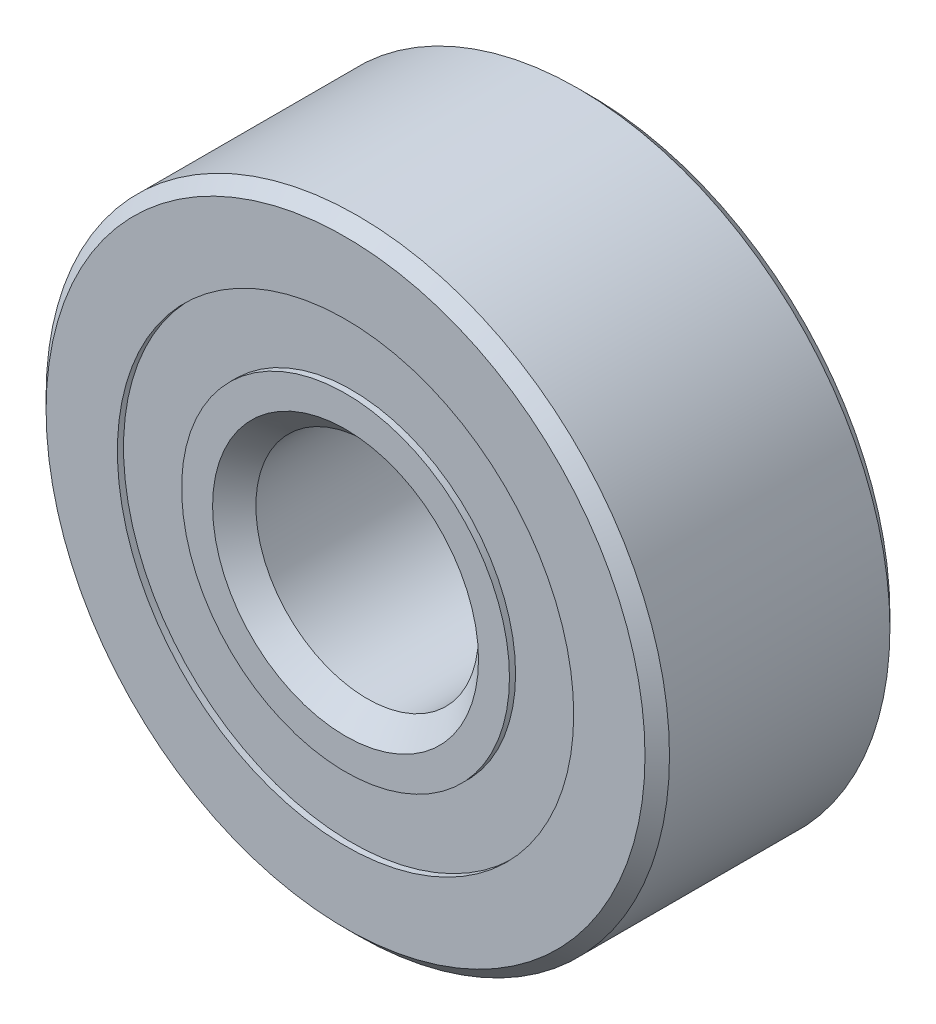
ISO-10303-21;
HEADER;
FILE_DESCRIPTION(('STEP AP214'),'2;1');
FILE_NAME('part.step','',(''),(''),'','','');
FILE_SCHEMA(('AUTOMOTIVE_DESIGN { 1 0 10303 214 1 1 1 1 }'));
ENDSEC;
DATA;
#1=APPLICATION_CONTEXT('core data for automotive mechanical design processes');
#2=APPLICATION_PROTOCOL_DEFINITION('international standard','automotive_design',2000,#1);
#3=PRODUCT_CONTEXT('',#1,'mechanical');
#4=PRODUCT('Part','Part','',(#3));
#5=PRODUCT_RELATED_PRODUCT_CATEGORY('part','',(#4));
#6=PRODUCT_DEFINITION_FORMATION('','',#4);
#7=PRODUCT_DEFINITION_CONTEXT('part definition',#1,'design');
#8=PRODUCT_DEFINITION('design','',#6,#7);
#9=PRODUCT_DEFINITION_SHAPE('','',#8);
#10=(LENGTH_UNIT() NAMED_UNIT(*) SI_UNIT(.MILLI.,.METRE.));
#11=(NAMED_UNIT(*) PLANE_ANGLE_UNIT() SI_UNIT($,.RADIAN.));
#12=(NAMED_UNIT(*) SI_UNIT($,.STERADIAN.) SOLID_ANGLE_UNIT());
#13=UNCERTAINTY_MEASURE_WITH_UNIT(LENGTH_MEASURE(1.E-05),#10,'distance_accuracy_value','');
#14=(GEOMETRIC_REPRESENTATION_CONTEXT(3) GLOBAL_UNCERTAINTY_ASSIGNED_CONTEXT((#13)) GLOBAL_UNIT_ASSIGNED_CONTEXT((#10,
#11,#12)) REPRESENTATION_CONTEXT('',''));
#15=CARTESIAN_POINT('',(0.,0.,0.));
#16=DIRECTION('',(0.,0.,1.));
#17=DIRECTION('',(1.,0.,0.));
#18=AXIS2_PLACEMENT_3D('',#15,#16,#17);
#19=CARTESIAN_POINT('',(0.,8.13375686813187,-4.14734375));
#20=DIRECTION('',(0.,0.,1.));
#21=DIRECTION('',(1.,0.,0.));
#22=AXIS2_PLACEMENT_3D('',#19,#20,#21);
#23=PLANE('',#22);
#24=CARTESIAN_POINT('',(0.,0.,-4.14734375));
#25=DIRECTION('',(0.,0.,1.));
#26=DIRECTION('',(1.,0.,0.));
#27=AXIS2_PLACEMENT_3D('',#24,#25,#26);
#28=CIRCLE('',#27,8.13375686813187);
#29=CARTESIAN_POINT('',(8.13375686813187,0.,-4.14734375));
#30=VERTEX_POINT('',#29);
#31=EDGE_CURVE('E66',#30,#30,#28,.T.);
#32=ORIENTED_EDGE('',*,*,#31,.F.);
#33=EDGE_LOOP('',(#32));
#34=FACE_BOUND('',#33,.T.);
#35=CARTESIAN_POINT('',(0.,0.,-4.14734375));
#36=DIRECTION('',(0.,0.,1.));
#37=DIRECTION('',(1.,0.,0.));
#38=AXIS2_PLACEMENT_3D('',#35,#36,#37);
#39=CIRCLE('',#38,5.84386235510606);
#40=CARTESIAN_POINT('',(5.84386235510606,0.,-4.14734375));
#41=VERTEX_POINT('',#40);
#42=EDGE_CURVE('E11',#41,#41,#39,.T.);
#43=ORIENTED_EDGE('',*,*,#42,.T.);
#44=EDGE_LOOP('',(#43));
#45=FACE_BOUND('',#44,.T.);
#46=ADVANCED_FACE('F52',(#34,#45),#23,.F.);
#47=CARTESIAN_POINT('',(0.,0.,4.365625));
#48=DIRECTION('',(0.,0.,1.));
#49=DIRECTION('',(1.,0.,0.));
#50=AXIS2_PLACEMENT_3D('',#47,#48,#49);
#51=CYLINDRICAL_SURFACE('',#50,5.84386235510606);
#52=ORIENTED_EDGE('',*,*,#42,.F.);
#53=EDGE_LOOP('',(#52));
#54=FACE_BOUND('',#53,.T.);
#55=CARTESIAN_POINT('',(0.,0.,-2.02891184331204));
#56=DIRECTION('',(0.,0.,1.));
#57=DIRECTION('',(1.,0.,0.));
#58=AXIS2_PLACEMENT_3D('',#55,#56,#57);
#59=CIRCLE('',#58,5.84386235510606);
#60=CARTESIAN_POINT('',(5.84386235510606,0.,-2.02891184331204));
#61=VERTEX_POINT('',#60);
#62=EDGE_CURVE('E58',#61,#61,#59,.T.);
#63=ORIENTED_EDGE('',*,*,#62,.T.);
#64=EDGE_LOOP('',(#63));
#65=FACE_BOUND('',#64,.T.);
#66=ADVANCED_FACE('F75',(#54,#65),#51,.F.);
#67=CARTESIAN_POINT('',(0.,8.13375686813187,-2.02891184331204));
#68=DIRECTION('',(0.,0.,-1.));
#69=DIRECTION('',(-1.,0.,0.));
#70=AXIS2_PLACEMENT_3D('',#67,#68,#69);
#71=PLANE('',#70);
#72=ORIENTED_EDGE('',*,*,#62,.F.);
#73=EDGE_LOOP('',(#72));
#74=FACE_BOUND('',#73,.T.);
#75=CARTESIAN_POINT('',(0.,0.,-2.02891184331204));
#76=DIRECTION('',(0.,0.,1.));
#77=DIRECTION('',(1.,0.,0.));
#78=AXIS2_PLACEMENT_3D('',#75,#76,#77);
#79=CIRCLE('',#78,8.13375686813187);
#80=CARTESIAN_POINT('',(8.13375686813187,0.,-2.02891184331204));
#81=VERTEX_POINT('',#80);
#82=EDGE_CURVE('E62',#81,#81,#79,.T.);
#83=ORIENTED_EDGE('',*,*,#82,.T.);
#84=EDGE_LOOP('',(#83));
#85=FACE_BOUND('',#84,.T.);
#86=ADVANCED_FACE('F79',(#74,#85),#71,.F.);
#87=CARTESIAN_POINT('',(0.,0.,4.365625));
#88=DIRECTION('',(0.,0.,1.));
#89=DIRECTION('',(1.,0.,0.));
#90=AXIS2_PLACEMENT_3D('',#87,#88,#89);
#91=CYLINDRICAL_SURFACE('',#90,8.13375686813187);
#92=ORIENTED_EDGE('',*,*,#82,.F.);
#93=EDGE_LOOP('',(#92));
#94=FACE_BOUND('',#93,.T.);
#95=ORIENTED_EDGE('',*,*,#31,.T.);
#96=EDGE_LOOP('',(#95));
#97=FACE_BOUND('',#96,.T.);
#98=ADVANCED_FACE('F72',(#94,#97),#91,.T.);
#99=CLOSED_SHELL('',(#46,#66,#86,#98));
#100=MANIFOLD_SOLID_BREP('B2',#99);
#101=CARTESIAN_POINT('',(0.,8.13375686813187,4.14734375));
#102=DIRECTION('',(0.,0.,-1.));
#103=DIRECTION('',(-1.,0.,0.));
#104=AXIS2_PLACEMENT_3D('',#101,#102,#103);
#105=PLANE('',#104);
#106=CARTESIAN_POINT('',(0.,0.,4.14734375));
#107=DIRECTION('',(0.,0.,1.));
#108=DIRECTION('',(1.,0.,0.));
#109=AXIS2_PLACEMENT_3D('',#106,#107,#108);
#110=CIRCLE('',#109,5.84386235510606);
#111=CARTESIAN_POINT('',(5.84386235510606,0.,4.14734375));
#112=VERTEX_POINT('',#111);
#113=EDGE_CURVE('E51',#112,#112,#110,.T.);
#114=ORIENTED_EDGE('',*,*,#113,.F.);
#115=EDGE_LOOP('',(#114));
#116=FACE_BOUND('',#115,.T.);
#117=CARTESIAN_POINT('',(0.,0.,4.14734375));
#118=DIRECTION('',(0.,0.,1.));
#119=DIRECTION('',(1.,0.,0.));
#120=AXIS2_PLACEMENT_3D('',#117,#118,#119);
#121=CIRCLE('',#120,8.13375686813187);
#122=CARTESIAN_POINT('',(8.13375686813187,0.,4.14734375));
#123=VERTEX_POINT('',#122);
#124=EDGE_CURVE('E126',#123,#123,#121,.T.);
#125=ORIENTED_EDGE('',*,*,#124,.T.);
#126=EDGE_LOOP('',(#125));
#127=FACE_BOUND('',#126,.T.);
#128=ADVANCED_FACE('F112',(#116,#127),#105,.F.);
#129=CARTESIAN_POINT('',(0.,0.,4.365625));
#130=DIRECTION('',(0.,0.,1.));
#131=DIRECTION('',(1.,0.,0.));
#132=AXIS2_PLACEMENT_3D('',#129,#130,#131);
#133=CYLINDRICAL_SURFACE('',#132,5.84386235510606);
#134=CARTESIAN_POINT('',(0.,0.,2.02891184331204));
#135=DIRECTION('',(0.,0.,1.));
#136=DIRECTION('',(1.,0.,0.));
#137=AXIS2_PLACEMENT_3D('',#134,#135,#136);
#138=CIRCLE('',#137,5.84386235510606);
#139=CARTESIAN_POINT('',(5.84386235510606,0.,2.02891184331204));
#140=VERTEX_POINT('',#139);
#141=EDGE_CURVE('E118',#140,#140,#138,.T.);
#142=ORIENTED_EDGE('',*,*,#141,.F.);
#143=EDGE_LOOP('',(#142));
#144=FACE_BOUND('',#143,.T.);
#145=ORIENTED_EDGE('',*,*,#113,.T.);
#146=EDGE_LOOP('',(#145));
#147=FACE_BOUND('',#146,.T.);
#148=ADVANCED_FACE('F141',(#144,#147),#133,.F.);
#149=CARTESIAN_POINT('',(0.,8.13375686813187,2.02891184331204));
#150=DIRECTION('',(0.,0.,1.));
#151=DIRECTION('',(1.,0.,0.));
#152=AXIS2_PLACEMENT_3D('',#149,#150,#151);
#153=PLANE('',#152);
#154=CARTESIAN_POINT('',(0.,0.,2.02891184331204));
#155=DIRECTION('',(0.,0.,1.));
#156=DIRECTION('',(1.,0.,0.));
#157=AXIS2_PLACEMENT_3D('',#154,#155,#156);
#158=CIRCLE('',#157,8.13375686813187);
#159=CARTESIAN_POINT('',(8.13375686813187,0.,2.02891184331204));
#160=VERTEX_POINT('',#159);
#161=EDGE_CURVE('E122',#160,#160,#158,.T.);
#162=ORIENTED_EDGE('',*,*,#161,.F.);
#163=EDGE_LOOP('',(#162));
#164=FACE_BOUND('',#163,.T.);
#165=ORIENTED_EDGE('',*,*,#141,.T.);
#166=EDGE_LOOP('',(#165));
#167=FACE_BOUND('',#166,.T.);
#168=ADVANCED_FACE('F136',(#164,#167),#153,.F.);
#169=CARTESIAN_POINT('',(0.,0.,4.365625));
#170=DIRECTION('',(0.,0.,1.));
#171=DIRECTION('',(1.,0.,0.));
#172=AXIS2_PLACEMENT_3D('',#169,#170,#171);
#173=CYLINDRICAL_SURFACE('',#172,8.13375686813187);
#174=ORIENTED_EDGE('',*,*,#124,.F.);
#175=EDGE_LOOP('',(#174));
#176=FACE_BOUND('',#175,.T.);
#177=ORIENTED_EDGE('',*,*,#161,.T.);
#178=EDGE_LOOP('',(#177));
#179=FACE_BOUND('',#178,.T.);
#180=ADVANCED_FACE('F133',(#176,#179),#173,.T.);
#181=CLOSED_SHELL('',(#128,#148,#168,#180));
#182=MANIFOLD_SOLID_BREP('B6',#181);
#183=CARTESIAN_POINT('',(-5.33202707188474,5.33202707188487,0.));
#184=DIRECTION('',(0.,0.,1.));
#185=DIRECTION('',(-0.707106781186539,0.707106781186556,0.));
#186=AXIS2_PLACEMENT_3D('',#183,#184,#185);
#187=SPHERICAL_SURFACE('',#186,2.02891184331204);
#188=CARTESIAN_POINT('',(-5.33202707188474,5.33202707188487,2.02891184331204));
#189=VERTEX_POINT('',#188);
#190=VERTEX_LOOP('',#189);
#191=FACE_BOUND('',#190,.T.);
#192=ADVANCED_FACE('F196',(#191),#187,.T.);
#193=CLOSED_SHELL('',(#192));
#194=MANIFOLD_SOLID_BREP('B46',#193);
#195=CARTESIAN_POINT('',(-7.540625,0.,0.));
#196=DIRECTION('',(0.,0.,1.));
#197=DIRECTION('',(-1.,0.,0.));
#198=AXIS2_PLACEMENT_3D('',#195,#196,#197);
#199=SPHERICAL_SURFACE('',#198,2.02891184331204);
#200=CARTESIAN_POINT('',(-7.540625,0.,2.02891184331204));
#201=VERTEX_POINT('',#200);
#202=VERTEX_LOOP('',#201);
#203=FACE_BOUND('',#202,.T.);
#204=ADVANCED_FACE('F233',(#203),#199,.T.);
#205=CLOSED_SHELL('',(#204));
#206=MANIFOLD_SOLID_BREP('B108',#205);
#207=CARTESIAN_POINT('',(-5.33202707188486,-5.33202707188476,0.));
#208=DIRECTION('',(0.,0.,1.));
#209=DIRECTION('',(-0.707106781186554,-0.707106781186541,0.));
#210=AXIS2_PLACEMENT_3D('',#207,#208,#209);
#211=SPHERICAL_SURFACE('',#210,2.02891184331204);
#212=CARTESIAN_POINT('',(-5.33202707188486,-5.33202707188476,2.02891184331204));
#213=VERTEX_POINT('',#212);
#214=VERTEX_LOOP('',#213);
#215=FACE_BOUND('',#214,.T.);
#216=ADVANCED_FACE('F268',(#215),#211,.T.);
#217=CLOSED_SHELL('',(#216));
#218=MANIFOLD_SOLID_BREP('B192',#217);
#219=CARTESIAN_POINT('',(0.,-7.540625,0.));
#220=DIRECTION('',(0.,0.,1.));
#221=DIRECTION('',(0.,-1.,0.));
#222=AXIS2_PLACEMENT_3D('',#219,#220,#221);
#223=SPHERICAL_SURFACE('',#222,2.02891184331204);
#224=CARTESIAN_POINT('',(0.,-7.540625,2.02891184331204));
#225=VERTEX_POINT('',#224);
#226=VERTEX_LOOP('',#225);
#227=FACE_BOUND('',#226,.T.);
#228=ADVANCED_FACE('F305',(#227),#223,.T.);
#229=CLOSED_SHELL('',(#228));
#230=MANIFOLD_SOLID_BREP('B229',#229);
#231=CARTESIAN_POINT('',(5.33202707188478,-5.33202707188484,0.));
#232=DIRECTION('',(0.,0.,1.));
#233=DIRECTION('',(0.707106781186544,-0.707106781186551,0.));
#234=AXIS2_PLACEMENT_3D('',#231,#232,#233);
#235=SPHERICAL_SURFACE('',#234,2.02891184331204);
#236=CARTESIAN_POINT('',(5.33202707188478,-5.33202707188484,2.02891184331204));
#237=VERTEX_POINT('',#236);
#238=VERTEX_LOOP('',#237);
#239=FACE_BOUND('',#238,.T.);
#240=ADVANCED_FACE('F342',(#239),#235,.T.);
#241=CLOSED_SHELL('',(#240));
#242=MANIFOLD_SOLID_BREP('B264',#241);
#243=CARTESIAN_POINT('',(7.540625,0.,0.));
#244=DIRECTION('',(0.,0.,1.));
#245=DIRECTION('',(1.,0.,0.));
#246=AXIS2_PLACEMENT_3D('',#243,#244,#245);
#247=SPHERICAL_SURFACE('',#246,2.02891184331204);
#248=CARTESIAN_POINT('',(7.540625,0.,2.02891184331204));
#249=VERTEX_POINT('',#248);
#250=VERTEX_LOOP('',#249);
#251=FACE_BOUND('',#250,.T.);
#252=ADVANCED_FACE('F377',(#251),#247,.T.);
#253=CLOSED_SHELL('',(#252));
#254=MANIFOLD_SOLID_BREP('B301',#253);
#255=CARTESIAN_POINT('',(5.33202707188482,5.3320270718848,0.));
#256=DIRECTION('',(0.,0.,1.));
#257=DIRECTION('',(0.707106781186549,0.707106781186546,0.));
#258=AXIS2_PLACEMENT_3D('',#255,#256,#257);
#259=SPHERICAL_SURFACE('',#258,2.02891184331204);
#260=CARTESIAN_POINT('',(5.33202707188482,5.3320270718848,2.02891184331204));
#261=VERTEX_POINT('',#260);
#262=VERTEX_LOOP('',#261);
#263=FACE_BOUND('',#262,.T.);
#264=ADVANCED_FACE('F412',(#263),#259,.T.);
#265=CLOSED_SHELL('',(#264));
#266=MANIFOLD_SOLID_BREP('B338',#265);
#267=CARTESIAN_POINT('',(0.,7.540625,0.));
#268=DIRECTION('',(0.,0.,1.));
#269=DIRECTION('',(0.,1.,0.));
#270=AXIS2_PLACEMENT_3D('',#267,#268,#269);
#271=SPHERICAL_SURFACE('',#270,2.02891184331204);
#272=CARTESIAN_POINT('',(0.,7.540625,2.02891184331204));
#273=VERTEX_POINT('',#272);
#274=VERTEX_LOOP('',#273);
#275=FACE_BOUND('',#274,.T.);
#276=ADVANCED_FACE('F451',(#275),#271,.T.);
#277=CLOSED_SHELL('',(#276));
#278=MANIFOLD_SOLID_BREP('B373',#277);
#279=CARTESIAN_POINT('',(0.,0.,4.365625));
#280=DIRECTION('',(0.,0.,1.));
#281=DIRECTION('',(1.,0.,0.));
#282=AXIS2_PLACEMENT_3D('',#279,#280,#281);
#283=CYLINDRICAL_SURFACE('',#282,5.84386235510606);
#284=CARTESIAN_POINT('',(0.,0.,4.365625));
#285=DIRECTION('',(0.,0.,1.));
#286=DIRECTION('',(1.,0.,0.));
#287=AXIS2_PLACEMENT_3D('',#284,#285,#286);
#288=CIRCLE('',#287,5.84386235510606);
#289=CARTESIAN_POINT('',(5.84386235510606,0.,4.365625));
#290=VERTEX_POINT('',#289);
#291=EDGE_CURVE('E509',#290,#290,#288,.T.);
#292=ORIENTED_EDGE('',*,*,#291,.F.);
#293=EDGE_LOOP('',(#292));
#294=FACE_BOUND('',#293,.T.);
#295=CARTESIAN_POINT('',(0.,0.,4.14734375));
#296=DIRECTION('',(0.,0.,1.));
#297=DIRECTION('',(1.,0.,0.));
#298=AXIS2_PLACEMENT_3D('',#295,#296,#297);
#299=CIRCLE('',#298,5.84386235510606);
#300=CARTESIAN_POINT('',(5.84386235510606,0.,4.14734375));
#301=VERTEX_POINT('',#300);
#302=EDGE_CURVE('E450',#301,#301,#299,.T.);
#303=ORIENTED_EDGE('',*,*,#302,.T.);
#304=EDGE_LOOP('',(#303));
#305=FACE_BOUND('',#304,.T.);
#306=ADVANCED_FACE('F469',(#294,#305),#283,.T.);
#307=CARTESIAN_POINT('',(0.,5.84386235510606,4.14734375));
#308=DIRECTION('',(0.,0.,1.));
#309=DIRECTION('',(1.,0.,0.));
#310=AXIS2_PLACEMENT_3D('',#307,#308,#309);
#311=PLANE('',#310);
#312=ORIENTED_EDGE('',*,*,#302,.F.);
#313=EDGE_LOOP('',(#312));
#314=FACE_BOUND('',#313,.T.);
#315=CARTESIAN_POINT('',(0.,0.,4.14734375));
#316=DIRECTION('',(0.,0.,1.));
#317=DIRECTION('',(1.,0.,0.));
#318=AXIS2_PLACEMENT_3D('',#315,#316,#317);
#319=CIRCLE('',#318,5.62558110510605);
#320=CARTESIAN_POINT('',(5.62558110510605,0.,4.14734375));
#321=VERTEX_POINT('',#320);
#322=EDGE_CURVE('E475',#321,#321,#319,.T.);
#323=ORIENTED_EDGE('',*,*,#322,.T.);
#324=EDGE_LOOP('',(#323));
#325=FACE_BOUND('',#324,.T.);
#326=ADVANCED_FACE('F516',(#314,#325),#311,.F.);
#327=CARTESIAN_POINT('',(0.,0.,3.26199422323793));
#328=DIRECTION('',(0.,0.,1.));
#329=DIRECTION('',(1.,0.,0.));
#330=AXIS2_PLACEMENT_3D('',#327,#328,#329);
#331=CONICAL_SURFACE('',#330,4.74023157834398,0.78539816339745);
#332=ORIENTED_EDGE('',*,*,#322,.F.);
#333=EDGE_LOOP('',(#332));
#334=FACE_BOUND('',#333,.T.);
#335=CARTESIAN_POINT('',(0.,0.,3.26199422323793));
#336=DIRECTION('',(0.,0.,1.));
#337=DIRECTION('',(1.,0.,0.));
#338=AXIS2_PLACEMENT_3D('',#335,#336,#337);
#339=CIRCLE('',#338,4.74023157834398);
#340=CARTESIAN_POINT('',(4.74023157834398,0.,3.26199422323793));
#341=VERTEX_POINT('',#340);
#342=EDGE_CURVE('E479',#341,#341,#339,.T.);
#343=ORIENTED_EDGE('',*,*,#342,.T.);
#344=EDGE_LOOP('',(#343));
#345=FACE_BOUND('',#344,.T.);
#346=ADVANCED_FACE('F520',(#334,#345),#331,.T.);
#347=CARTESIAN_POINT('',(0.,0.,4.365625));
#348=DIRECTION('',(0.,0.,1.));
#349=DIRECTION('',(1.,0.,0.));
#350=AXIS2_PLACEMENT_3D('',#347,#348,#349);
#351=CYLINDRICAL_SURFACE('',#350,4.74023157834398);
#352=ORIENTED_EDGE('',*,*,#342,.F.);
#353=EDGE_LOOP('',(#352));
#354=FACE_BOUND('',#353,.T.);
#355=CARTESIAN_POINT('',(0.,0.,0.));
#356=DIRECTION('',(0.,0.,1.));
#357=DIRECTION('',(1.,0.,0.));
#358=AXIS2_PLACEMENT_3D('',#355,#356,#357);
#359=CIRCLE('',#358,4.74023157834398);
#360=CARTESIAN_POINT('',(4.74023157834398,0.,0.));
#361=VERTEX_POINT('',#360);
#362=EDGE_CURVE('E483',#361,#361,#359,.T.);
#363=ORIENTED_EDGE('',*,*,#362,.T.);
#364=EDGE_LOOP('',(#363));
#365=FACE_BOUND('',#364,.T.);
#366=ADVANCED_FACE('F525',(#354,#365),#351,.T.);
#367=CARTESIAN_POINT('',(0.,4.74023157834398,0.));
#368=DIRECTION('',(0.,0.,-1.));
#369=DIRECTION('',(-1.,0.,0.));
#370=AXIS2_PLACEMENT_3D('',#367,#368,#369);
#371=PLANE('',#370);
#372=ORIENTED_EDGE('',*,*,#362,.F.);
#373=EDGE_LOOP('',(#372));
#374=FACE_BOUND('',#373,.T.);
#375=CARTESIAN_POINT('',(0.,0.,0.));
#376=DIRECTION('',(0.,0.,1.));
#377=DIRECTION('',(1.,0.,0.));
#378=AXIS2_PLACEMENT_3D('',#375,#376,#377);
#379=CIRCLE('',#378,5.51171315668796);
#380=CARTESIAN_POINT('',(5.51171315668796,0.,0.));
#381=VERTEX_POINT('',#380);
#382=EDGE_CURVE('E488',#381,#381,#379,.T.);
#383=ORIENTED_EDGE('',*,*,#382,.T.);
#384=EDGE_LOOP('',(#383));
#385=FACE_BOUND('',#384,.T.);
#386=ADVANCED_FACE('F531',(#374,#385),#371,.F.);
#387=CARTESIAN_POINT('',(0.,0.,0.));
#388=DIRECTION('',(0.,0.,1.));
#389=DIRECTION('',(1.,0.,0.));
#390=AXIS2_PLACEMENT_3D('',#387,#388,#389);
#391=TOROIDAL_SURFACE('',#390,7.540625,2.02891184331204);
#392=ORIENTED_EDGE('',*,*,#382,.F.);
#393=EDGE_LOOP('',(#392));
#394=FACE_BOUND('',#393,.T.);
#395=CARTESIAN_POINT('',(0.,0.,-1.94027777777778));
#396=DIRECTION('',(0.,0.,1.));
#397=DIRECTION('',(1.,0.,0.));
#398=AXIS2_PLACEMENT_3D('',#395,#396,#397);
#399=CIRCLE('',#398,6.94749313186813);
#400=CARTESIAN_POINT('',(6.94749313186813,0.,-1.94027777777778));
#401=VERTEX_POINT('',#400);
#402=EDGE_CURVE('E491',#401,#401,#399,.T.);
#403=ORIENTED_EDGE('',*,*,#402,.T.);
#404=EDGE_LOOP('',(#403));
#405=FACE_BOUND('',#404,.T.);
#406=ADVANCED_FACE('F535',(#394,#405),#391,.F.);
#407=CARTESIAN_POINT('',(0.,0.,4.365625));
#408=DIRECTION('',(0.,0.,1.));
#409=DIRECTION('',(1.,0.,0.));
#410=AXIS2_PLACEMENT_3D('',#407,#408,#409);
#411=CYLINDRICAL_SURFACE('',#410,6.94749313186813);
#412=ORIENTED_EDGE('',*,*,#402,.F.);
#413=EDGE_LOOP('',(#412));
#414=FACE_BOUND('',#413,.T.);
#415=CARTESIAN_POINT('',(0.,0.,-4.365625));
#416=DIRECTION('',(0.,0.,1.));
#417=DIRECTION('',(1.,0.,0.));
#418=AXIS2_PLACEMENT_3D('',#415,#416,#417);
#419=CIRCLE('',#418,6.94749313186813);
#420=CARTESIAN_POINT('',(6.94749313186813,0.,-4.365625));
#421=VERTEX_POINT('',#420);
#422=EDGE_CURVE('E494',#421,#421,#419,.T.);
#423=ORIENTED_EDGE('',*,*,#422,.T.);
#424=EDGE_LOOP('',(#423));
#425=FACE_BOUND('',#424,.T.);
#426=ADVANCED_FACE('F539',(#414,#425),#411,.T.);
#427=CARTESIAN_POINT('',(0.,4.4053125,-4.365625));
#428=DIRECTION('',(0.,0.,1.));
#429=DIRECTION('',(1.,0.,0.));
#430=AXIS2_PLACEMENT_3D('',#427,#428,#429);
#431=PLANE('',#430);
#432=ORIENTED_EDGE('',*,*,#422,.F.);
#433=EDGE_LOOP('',(#432));
#434=FACE_BOUND('',#433,.T.);
#435=CARTESIAN_POINT('',(0.,0.,-4.365625));
#436=DIRECTION('',(0.,0.,1.));
#437=DIRECTION('',(1.,0.,0.));
#438=AXIS2_PLACEMENT_3D('',#435,#436,#437);
#439=CIRCLE('',#438,4.4053125);
#440=CARTESIAN_POINT('',(4.4053125,0.,-4.365625));
#441=VERTEX_POINT('',#440);
#442=EDGE_CURVE('E497',#441,#441,#439,.T.);
#443=ORIENTED_EDGE('',*,*,#442,.T.);
#444=EDGE_LOOP('',(#443));
#445=FACE_BOUND('',#444,.T.);
#446=ADVANCED_FACE('F543',(#434,#445),#431,.F.);
#447=CARTESIAN_POINT('',(0.,0.,-3.9290625));
#448=DIRECTION('',(0.,0.,-1.));
#449=DIRECTION('',(-1.,0.,0.));
#450=AXIS2_PLACEMENT_3D('',#447,#448,#449);
#451=CONICAL_SURFACE('',#450,3.96875,0.785398163397447);
#452=ORIENTED_EDGE('',*,*,#442,.F.);
#453=EDGE_LOOP('',(#452));
#454=FACE_BOUND('',#453,.T.);
#455=CARTESIAN_POINT('',(0.,0.,-3.9290625));
#456=DIRECTION('',(0.,0.,1.));
#457=DIRECTION('',(1.,0.,0.));
#458=AXIS2_PLACEMENT_3D('',#455,#456,#457);
#459=CIRCLE('',#458,3.96875);
#460=CARTESIAN_POINT('',(3.96875,0.,-3.9290625));
#461=VERTEX_POINT('',#460);
#462=EDGE_CURVE('E500',#461,#461,#459,.T.);
#463=ORIENTED_EDGE('',*,*,#462,.T.);
#464=EDGE_LOOP('',(#463));
#465=FACE_BOUND('',#464,.T.);
#466=ADVANCED_FACE('F547',(#454,#465),#451,.F.);
#467=CARTESIAN_POINT('',(0.,0.,4.365625));
#468=DIRECTION('',(0.,0.,1.));
#469=DIRECTION('',(1.,0.,0.));
#470=AXIS2_PLACEMENT_3D('',#467,#468,#469);
#471=CYLINDRICAL_SURFACE('',#470,3.96875);
#472=ORIENTED_EDGE('',*,*,#462,.F.);
#473=EDGE_LOOP('',(#472));
#474=FACE_BOUND('',#473,.T.);
#475=CARTESIAN_POINT('',(0.,0.,3.59414342165603));
#476=DIRECTION('',(0.,0.,1.));
#477=DIRECTION('',(1.,0.,0.));
#478=AXIS2_PLACEMENT_3D('',#475,#476,#477);
#479=CIRCLE('',#478,3.96875);
#480=CARTESIAN_POINT('',(3.96875,0.,3.59414342165603));
#481=VERTEX_POINT('',#480);
#482=EDGE_CURVE('E503',#481,#481,#479,.T.);
#483=ORIENTED_EDGE('',*,*,#482,.T.);
#484=EDGE_LOOP('',(#483));
#485=FACE_BOUND('',#484,.T.);
#486=ADVANCED_FACE('F551',(#474,#485),#471,.F.);
#487=CARTESIAN_POINT('',(0.,0.,4.365625));
#488=DIRECTION('',(0.,0.,1.));
#489=DIRECTION('',(1.,0.,0.));
#490=AXIS2_PLACEMENT_3D('',#487,#488,#489);
#491=CONICAL_SURFACE('',#490,4.74023157834398,0.78539816339745);
#492=ORIENTED_EDGE('',*,*,#482,.F.);
#493=EDGE_LOOP('',(#492));
#494=FACE_BOUND('',#493,.T.);
#495=CARTESIAN_POINT('',(0.,0.,4.365625));
#496=DIRECTION('',(0.,0.,1.));
#497=DIRECTION('',(1.,0.,0.));
#498=AXIS2_PLACEMENT_3D('',#495,#496,#497);
#499=CIRCLE('',#498,4.74023157834398);
#500=CARTESIAN_POINT('',(4.74023157834398,0.,4.365625));
#501=VERTEX_POINT('',#500);
#502=EDGE_CURVE('E506',#501,#501,#499,.T.);
#503=ORIENTED_EDGE('',*,*,#502,.T.);
#504=EDGE_LOOP('',(#503));
#505=FACE_BOUND('',#504,.T.);
#506=ADVANCED_FACE('F555',(#494,#505),#491,.F.);
#507=CARTESIAN_POINT('',(0.,5.84386235510606,4.365625));
#508=DIRECTION('',(0.,0.,-1.));
#509=DIRECTION('',(-1.,0.,0.));
#510=AXIS2_PLACEMENT_3D('',#507,#508,#509);
#511=PLANE('',#510);
#512=ORIENTED_EDGE('',*,*,#502,.F.);
#513=EDGE_LOOP('',(#512));
#514=FACE_BOUND('',#513,.T.);
#515=ORIENTED_EDGE('',*,*,#291,.T.);
#516=EDGE_LOOP('',(#515));
#517=FACE_BOUND('',#516,.T.);
#518=ADVANCED_FACE('F513',(#514,#517),#511,.F.);
#519=CLOSED_SHELL('',(#306,#326,#346,#366,#386,#406,#426,#446,#466,#486,#506,#518));
#520=MANIFOLD_SOLID_BREP('B408',#519);
#521=CARTESIAN_POINT('',(0.,0.,3.9290625));
#522=DIRECTION('',(0.,0.,-1.));
#523=DIRECTION('',(-1.,0.,0.));
#524=AXIS2_PLACEMENT_3D('',#521,#522,#523);
#525=CONICAL_SURFACE('',#524,11.1125,0.785398163397447);
#526=CARTESIAN_POINT('',(0.,0.,4.365625));
#527=DIRECTION('',(0.,0.,1.));
#528=DIRECTION('',(1.,0.,0.));
#529=AXIS2_PLACEMENT_3D('',#526,#527,#528);
#530=CIRCLE('',#529,10.6759375);
#531=CARTESIAN_POINT('',(10.6759375,0.,4.365625));
#532=VERTEX_POINT('',#531);
#533=EDGE_CURVE('E655',#532,#532,#530,.T.);
#534=ORIENTED_EDGE('',*,*,#533,.F.);
#535=EDGE_LOOP('',(#534));
#536=FACE_BOUND('',#535,.T.);
#537=CARTESIAN_POINT('',(0.,0.,3.9290625));
#538=DIRECTION('',(0.,0.,1.));
#539=DIRECTION('',(1.,0.,0.));
#540=AXIS2_PLACEMENT_3D('',#537,#538,#539);
#541=CIRCLE('',#540,11.1125);
#542=CARTESIAN_POINT('',(11.1125,0.,3.9290625));
#543=VERTEX_POINT('',#542);
#544=EDGE_CURVE('E468',#543,#543,#541,.T.);
#545=ORIENTED_EDGE('',*,*,#544,.T.);
#546=EDGE_LOOP('',(#545));
#547=FACE_BOUND('',#546,.T.);
#548=ADVANCED_FACE('F627',(#536,#547),#525,.T.);
#549=CARTESIAN_POINT('',(0.,0.,4.365625));
#550=DIRECTION('',(0.,0.,1.));
#551=DIRECTION('',(1.,0.,0.));
#552=AXIS2_PLACEMENT_3D('',#549,#550,#551);
#553=CYLINDRICAL_SURFACE('',#552,11.1125);
#554=ORIENTED_EDGE('',*,*,#544,.F.);
#555=EDGE_LOOP('',(#554));
#556=FACE_BOUND('',#555,.T.);
#557=CARTESIAN_POINT('',(0.,0.,-3.9290625));
#558=DIRECTION('',(0.,0.,1.));
#559=DIRECTION('',(1.,0.,0.));
#560=AXIS2_PLACEMENT_3D('',#557,#558,#559);
#561=CIRCLE('',#560,11.1125);
#562=CARTESIAN_POINT('',(11.1125,0.,-3.9290625));
#563=VERTEX_POINT('',#562);
#564=EDGE_CURVE('E633',#563,#563,#561,.T.);
#565=ORIENTED_EDGE('',*,*,#564,.T.);
#566=EDGE_LOOP('',(#565));
#567=FACE_BOUND('',#566,.T.);
#568=ADVANCED_FACE('F662',(#556,#567),#553,.T.);
#569=CARTESIAN_POINT('',(0.,0.,-4.365625));
#570=DIRECTION('',(0.,0.,1.));
#571=DIRECTION('',(1.,0.,0.));
#572=AXIS2_PLACEMENT_3D('',#569,#570,#571);
#573=CONICAL_SURFACE('',#572,10.6759375,0.785398163397446);
#574=ORIENTED_EDGE('',*,*,#564,.F.);
#575=EDGE_LOOP('',(#574));
#576=FACE_BOUND('',#575,.T.);
#577=CARTESIAN_POINT('',(0.,0.,-4.365625));
#578=DIRECTION('',(0.,0.,1.));
#579=DIRECTION('',(1.,0.,0.));
#580=AXIS2_PLACEMENT_3D('',#577,#578,#579);
#581=CIRCLE('',#580,10.6759375);
#582=CARTESIAN_POINT('',(10.6759375,0.,-4.365625));
#583=VERTEX_POINT('',#582);
#584=EDGE_CURVE('E637',#583,#583,#581,.T.);
#585=ORIENTED_EDGE('',*,*,#584,.T.);
#586=EDGE_LOOP('',(#585));
#587=FACE_BOUND('',#586,.T.);
#588=ADVANCED_FACE('F666',(#576,#587),#573,.T.);
#589=CARTESIAN_POINT('',(0.,10.6759375,-4.365625));
#590=DIRECTION('',(0.,0.,1.));
#591=DIRECTION('',(1.,0.,0.));
#592=AXIS2_PLACEMENT_3D('',#589,#590,#591);
#593=PLANE('',#592);
#594=ORIENTED_EDGE('',*,*,#584,.F.);
#595=EDGE_LOOP('',(#594));
#596=FACE_BOUND('',#595,.T.);
#597=CARTESIAN_POINT('',(0.,0.,-4.365625));
#598=DIRECTION('',(0.,0.,1.));
#599=DIRECTION('',(1.,0.,0.));
#600=AXIS2_PLACEMENT_3D('',#597,#598,#599);
#601=CIRCLE('',#600,8.13375686813187);
#602=CARTESIAN_POINT('',(8.13375686813187,0.,-4.365625));
#603=VERTEX_POINT('',#602);
#604=EDGE_CURVE('E641',#603,#603,#601,.T.);
#605=ORIENTED_EDGE('',*,*,#604,.T.);
#606=EDGE_LOOP('',(#605));
#607=FACE_BOUND('',#606,.T.);
#608=ADVANCED_FACE('F671',(#596,#607),#593,.F.);
#609=CARTESIAN_POINT('',(0.,0.,4.365625));
#610=DIRECTION('',(0.,0.,1.));
#611=DIRECTION('',(1.,0.,0.));
#612=AXIS2_PLACEMENT_3D('',#609,#610,#611);
#613=CYLINDRICAL_SURFACE('',#612,8.13375686813187);
#614=ORIENTED_EDGE('',*,*,#604,.F.);
#615=EDGE_LOOP('',(#614));
#616=FACE_BOUND('',#615,.T.);
#617=CARTESIAN_POINT('',(0.,0.,-1.94027777777778));
#618=DIRECTION('',(0.,0.,1.));
#619=DIRECTION('',(1.,0.,0.));
#620=AXIS2_PLACEMENT_3D('',#617,#618,#619);
#621=CIRCLE('',#620,8.13375686813187);
#622=CARTESIAN_POINT('',(8.13375686813187,0.,-1.94027777777778));
#623=VERTEX_POINT('',#622);
#624=EDGE_CURVE('E646',#623,#623,#621,.T.);
#625=ORIENTED_EDGE('',*,*,#624,.T.);
#626=EDGE_LOOP('',(#625));
#627=FACE_BOUND('',#626,.T.);
#628=ADVANCED_FACE('F677',(#616,#627),#613,.F.);
#629=CARTESIAN_POINT('',(0.,0.,0.));
#630=DIRECTION('',(0.,0.,1.));
#631=DIRECTION('',(1.,0.,0.));
#632=AXIS2_PLACEMENT_3D('',#629,#630,#631);
#633=TOROIDAL_SURFACE('',#632,7.540625,2.02891184331204);
#634=ORIENTED_EDGE('',*,*,#624,.F.);
#635=EDGE_LOOP('',(#634));
#636=FACE_BOUND('',#635,.T.);
#637=CARTESIAN_POINT('',(0.,0.,1.94027777777778));
#638=DIRECTION('',(0.,0.,1.));
#639=DIRECTION('',(1.,0.,0.));
#640=AXIS2_PLACEMENT_3D('',#637,#638,#639);
#641=CIRCLE('',#640,8.13375686813187);
#642=CARTESIAN_POINT('',(8.13375686813187,0.,1.94027777777778));
#643=VERTEX_POINT('',#642);
#644=EDGE_CURVE('E649',#643,#643,#641,.T.);
#645=ORIENTED_EDGE('',*,*,#644,.T.);
#646=EDGE_LOOP('',(#645));
#647=FACE_BOUND('',#646,.T.);
#648=ADVANCED_FACE('F681',(#636,#647),#633,.F.);
#649=CARTESIAN_POINT('',(0.,0.,4.365625));
#650=DIRECTION('',(0.,0.,1.));
#651=DIRECTION('',(1.,0.,0.));
#652=AXIS2_PLACEMENT_3D('',#649,#650,#651);
#653=CYLINDRICAL_SURFACE('',#652,8.13375686813187);
#654=ORIENTED_EDGE('',*,*,#644,.F.);
#655=EDGE_LOOP('',(#654));
#656=FACE_BOUND('',#655,.T.);
#657=CARTESIAN_POINT('',(0.,0.,4.365625));
#658=DIRECTION('',(0.,0.,1.));
#659=DIRECTION('',(1.,0.,0.));
#660=AXIS2_PLACEMENT_3D('',#657,#658,#659);
#661=CIRCLE('',#660,8.13375686813187);
#662=CARTESIAN_POINT('',(8.13375686813187,0.,4.365625));
#663=VERTEX_POINT('',#662);
#664=EDGE_CURVE('E652',#663,#663,#661,.T.);
#665=ORIENTED_EDGE('',*,*,#664,.T.);
#666=EDGE_LOOP('',(#665));
#667=FACE_BOUND('',#666,.T.);
#668=ADVANCED_FACE('F685',(#656,#667),#653,.F.);
#669=CARTESIAN_POINT('',(0.,10.6759375,4.365625));
#670=DIRECTION('',(0.,0.,-1.));
#671=DIRECTION('',(-1.,0.,0.));
#672=AXIS2_PLACEMENT_3D('',#669,#670,#671);
#673=PLANE('',#672);
#674=ORIENTED_EDGE('',*,*,#664,.F.);
#675=EDGE_LOOP('',(#674));
#676=FACE_BOUND('',#675,.T.);
#677=ORIENTED_EDGE('',*,*,#533,.T.);
#678=EDGE_LOOP('',(#677));
#679=FACE_BOUND('',#678,.T.);
#680=ADVANCED_FACE('F659',(#676,#679),#673,.F.);
#681=CLOSED_SHELL('',(#548,#568,#588,#608,#628,#648,#668,#680));
#682=MANIFOLD_SOLID_BREP('B445',#681);
#683=ADVANCED_BREP_SHAPE_REPRESENTATION('',(#18,#100,#182,#194,#206,#218,#230,#242,#254,#266,
#278,#520,#682),#14);
#684=SHAPE_DEFINITION_REPRESENTATION(#9,#683);
ENDSEC;
END-ISO-10303-21;
